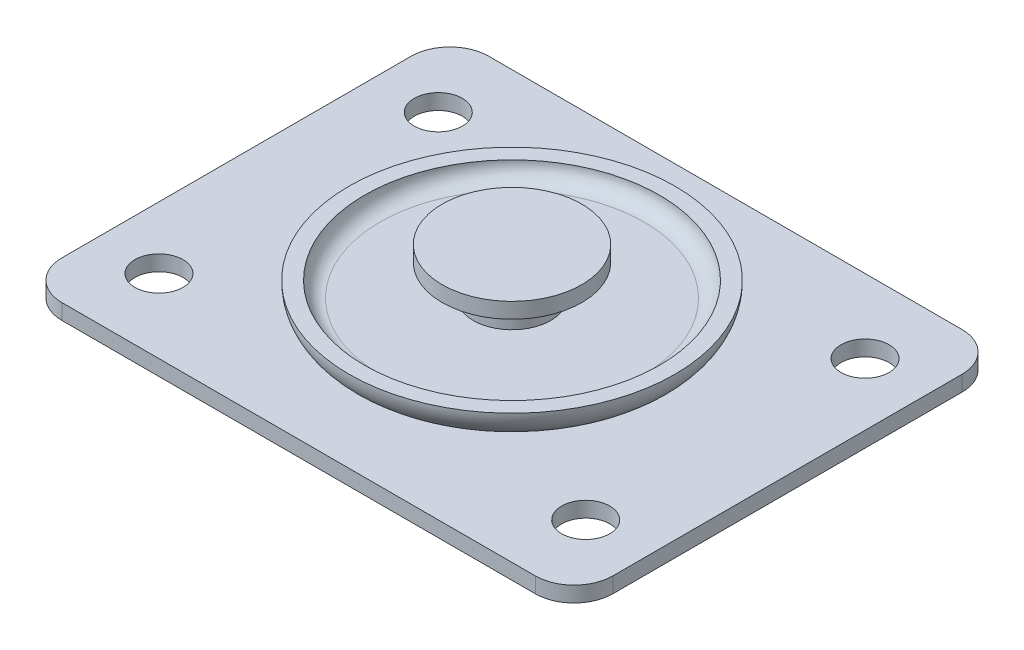
ISO-10303-21;
HEADER;
FILE_DESCRIPTION(('STEP AP214'),'2;1');
FILE_NAME('part.step','',(''),(''),'','','');
FILE_SCHEMA(('AUTOMOTIVE_DESIGN { 1 0 10303 214 1 1 1 1 }'));
ENDSEC;
DATA;
#1=APPLICATION_CONTEXT('core data for automotive mechanical design processes');
#2=APPLICATION_PROTOCOL_DEFINITION('international standard','automotive_design',2000,#1);
#3=PRODUCT_CONTEXT('',#1,'mechanical');
#4=PRODUCT('Part','Part','',(#3));
#5=PRODUCT_RELATED_PRODUCT_CATEGORY('part','',(#4));
#6=PRODUCT_DEFINITION_FORMATION('','',#4);
#7=PRODUCT_DEFINITION_CONTEXT('part definition',#1,'design');
#8=PRODUCT_DEFINITION('design','',#6,#7);
#9=PRODUCT_DEFINITION_SHAPE('','',#8);
#10=(LENGTH_UNIT() NAMED_UNIT(*) SI_UNIT(.MILLI.,.METRE.));
#11=(NAMED_UNIT(*) PLANE_ANGLE_UNIT() SI_UNIT($,.RADIAN.));
#12=(NAMED_UNIT(*) SI_UNIT($,.STERADIAN.) SOLID_ANGLE_UNIT());
#13=UNCERTAINTY_MEASURE_WITH_UNIT(LENGTH_MEASURE(1.E-05),#10,'distance_accuracy_value','');
#14=(GEOMETRIC_REPRESENTATION_CONTEXT(3) GLOBAL_UNCERTAINTY_ASSIGNED_CONTEXT((#13)) GLOBAL_UNIT_ASSIGNED_CONTEXT((#10,
#11,#12)) REPRESENTATION_CONTEXT('',''));
#15=CARTESIAN_POINT('',(0.,0.,0.));
#16=DIRECTION('',(0.,0.,1.));
#17=DIRECTION('',(1.,0.,0.));
#18=AXIS2_PLACEMENT_3D('',#15,#16,#17);
#19=CARTESIAN_POINT('',(-2.08166817117217E-13,2.,0.));
#20=DIRECTION('',(0.,1.,0.));
#21=DIRECTION('',(0.,0.,1.));
#22=AXIS2_PLACEMENT_3D('',#19,#20,#21);
#23=TOROIDAL_SURFACE('',#22,17.0000000000004,3.99999999999971);
#24=CARTESIAN_POINT('',(-2.08166817117217E-13,-2.,0.));
#25=DIRECTION('',(0.,1.,0.));
#26=DIRECTION('',(0.,0.,1.));
#27=AXIS2_PLACEMENT_3D('',#24,#25,#26);
#28=CIRCLE('',#27,17.0000000000004);
#29=CARTESIAN_POINT('',(-2.08166817117217E-13,-2.,17.0000000000004));
#30=VERTEX_POINT('',#29);
#31=EDGE_CURVE('E188',#30,#30,#28,.F.);
#32=ORIENTED_EDGE('',*,*,#31,.F.);
#33=EDGE_LOOP('',(#32));
#34=FACE_BOUND('',#33,.T.);
#35=CARTESIAN_POINT('',(-2.08166817117217E-13,2.,0.));
#36=DIRECTION('',(0.,1.,0.));
#37=DIRECTION('',(0.,0.,1.));
#38=AXIS2_PLACEMENT_3D('',#35,#36,#37);
#39=CIRCLE('',#38,21.);
#40=CARTESIAN_POINT('',(-2.08166817117217E-13,2.,21.));
#41=VERTEX_POINT('',#40);
#42=EDGE_CURVE('E193',#41,#41,#39,.T.);
#43=ORIENTED_EDGE('',*,*,#42,.F.);
#44=EDGE_LOOP('',(#43));
#45=FACE_BOUND('',#44,.T.);
#46=ADVANCED_FACE('F44',(#34,#45),#23,.T.);
#47=CARTESIAN_POINT('',(-2.08166817117217E-13,2.85578852232682E-13,0.));
#48=DIRECTION('',(0.,1.,0.));
#49=DIRECTION('',(0.,0.,1.));
#50=AXIS2_PLACEMENT_3D('',#47,#48,#49);
#51=PLANE('',#50);
#52=CARTESIAN_POINT('',(0.,2.85578852232682E-13,0.));
#53=DIRECTION('',(0.,1.,0.));
#54=DIRECTION('',(0.,0.,1.));
#55=AXIS2_PLACEMENT_3D('',#52,#53,#54);
#56=CIRCLE('',#55,5.);
#57=CARTESIAN_POINT('',(0.,2.85578852232682E-13,5.));
#58=VERTEX_POINT('',#57);
#59=EDGE_CURVE('E142',#58,#58,#56,.T.);
#60=ORIENTED_EDGE('',*,*,#59,.F.);
#61=EDGE_LOOP('',(#60));
#62=FACE_BOUND('',#61,.T.);
#63=CARTESIAN_POINT('',(-2.08166817117217E-13,2.84494650060196E-13,0.));
#64=DIRECTION('',(0.,1.,0.));
#65=DIRECTION('',(0.,0.,1.));
#66=AXIS2_PLACEMENT_3D('',#63,#64,#65);
#67=CIRCLE('',#66,17.0000000000004);
#68=CARTESIAN_POINT('',(-2.08166817117217E-13,2.84494650060196E-13,17.0000000000004));
#69=VERTEX_POINT('',#68);
#70=EDGE_CURVE('E149',#69,#69,#67,.T.);
#71=ORIENTED_EDGE('',*,*,#70,.T.);
#72=EDGE_LOOP('',(#71));
#73=FACE_BOUND('',#72,.T.);
#74=ADVANCED_FACE('F219',(#62,#73),#51,.T.);
#75=CARTESIAN_POINT('',(-2.08166817117217E-13,2.,0.));
#76=DIRECTION('',(0.,1.,0.));
#77=DIRECTION('',(0.,0.,1.));
#78=AXIS2_PLACEMENT_3D('',#75,#76,#77);
#79=TOROIDAL_SURFACE('',#78,17.0000000000004,1.99999999999972);
#80=CARTESIAN_POINT('',(-2.08166817117217E-13,2.,0.));
#81=DIRECTION('',(0.,1.,0.));
#82=DIRECTION('',(0.,0.,1.));
#83=AXIS2_PLACEMENT_3D('',#80,#81,#82);
#84=CIRCLE('',#83,19.0000000000001);
#85=CARTESIAN_POINT('',(-2.08166817117217E-13,2.,19.0000000000001));
#86=VERTEX_POINT('',#85);
#87=EDGE_CURVE('E213',#86,#86,#84,.T.);
#88=ORIENTED_EDGE('',*,*,#87,.T.);
#89=EDGE_LOOP('',(#88));
#90=FACE_BOUND('',#89,.T.);
#91=ORIENTED_EDGE('',*,*,#70,.F.);
#92=EDGE_LOOP('',(#91));
#93=FACE_BOUND('',#92,.T.);
#94=ADVANCED_FACE('F225',(#90,#93),#79,.F.);
#95=CARTESIAN_POINT('',(18.9999999999999,2.,0.));
#96=DIRECTION('',(0.,1.,0.));
#97=DIRECTION('',(0.,0.,1.));
#98=AXIS2_PLACEMENT_3D('',#95,#96,#97);
#99=PLANE('',#98);
#100=ORIENTED_EDGE('',*,*,#42,.T.);
#101=EDGE_LOOP('',(#100));
#102=FACE_BOUND('',#101,.T.);
#103=ORIENTED_EDGE('',*,*,#87,.F.);
#104=EDGE_LOOP('',(#103));
#105=FACE_BOUND('',#104,.T.);
#106=ADVANCED_FACE('F221',(#102,#105),#99,.T.);
#107=CARTESIAN_POINT('',(35.5,-4.,27.5));
#108=DIRECTION('',(1.,0.,0.));
#109=DIRECTION('',(0.,0.,-1.));
#110=AXIS2_PLACEMENT_3D('',#107,#108,#109);
#111=PLANE('',#110);
#112=DIRECTION('',(0.,0.,-1.));
#113=VECTOR('',#112,1.);
#114=CARTESIAN_POINT('',(35.5,-4.,27.5));
#115=LINE('',#114,#113);
#116=CARTESIAN_POINT('',(35.5,-4.,22.5));
#117=VERTEX_POINT('',#116);
#118=CARTESIAN_POINT('',(35.5,-4.,-22.5));
#119=VERTEX_POINT('',#118);
#120=EDGE_CURVE('E208',#117,#119,#115,.T.);
#121=ORIENTED_EDGE('',*,*,#120,.T.);
#122=DIRECTION('',(0.,1.,0.));
#123=VECTOR('',#122,1.);
#124=CARTESIAN_POINT('',(35.5,-4.,-22.5));
#125=LINE('',#124,#123);
#126=CARTESIAN_POINT('',(35.5,-2.,-22.5));
#127=VERTEX_POINT('',#126);
#128=EDGE_CURVE('E133',#119,#127,#125,.T.);
#129=ORIENTED_EDGE('',*,*,#128,.T.);
#130=DIRECTION('',(0.,0.,-1.));
#131=VECTOR('',#130,1.);
#132=CARTESIAN_POINT('',(35.5,-2.,27.5));
#133=LINE('',#132,#131);
#134=CARTESIAN_POINT('',(35.5,-2.,22.5));
#135=VERTEX_POINT('',#134);
#136=EDGE_CURVE('E113',#135,#127,#133,.T.);
#137=ORIENTED_EDGE('',*,*,#136,.F.);
#138=DIRECTION('',(0.,1.,0.));
#139=VECTOR('',#138,1.);
#140=CARTESIAN_POINT('',(35.5,-4.,22.5));
#141=LINE('',#140,#139);
#142=EDGE_CURVE('E128',#135,#117,#141,.F.);
#143=ORIENTED_EDGE('',*,*,#142,.T.);
#144=EDGE_LOOP('',(#121,#129,#137,#143));
#145=FACE_BOUND('',#144,.T.);
#146=ADVANCED_FACE('F129',(#145),#111,.T.);
#147=CARTESIAN_POINT('',(-35.5,-4.,27.5));
#148=DIRECTION('',(0.,0.,1.));
#149=DIRECTION('',(1.,0.,0.));
#150=AXIS2_PLACEMENT_3D('',#147,#148,#149);
#151=PLANE('',#150);
#152=DIRECTION('',(1.,0.,0.));
#153=VECTOR('',#152,1.);
#154=CARTESIAN_POINT('',(-35.5,-4.,27.5));
#155=LINE('',#154,#153);
#156=CARTESIAN_POINT('',(-30.5,-4.,27.5));
#157=VERTEX_POINT('',#156);
#158=CARTESIAN_POINT('',(30.5,-4.,27.5));
#159=VERTEX_POINT('',#158);
#160=EDGE_CURVE('E187',#157,#159,#155,.T.);
#161=ORIENTED_EDGE('',*,*,#160,.T.);
#162=DIRECTION('',(0.,1.,0.));
#163=VECTOR('',#162,1.);
#164=CARTESIAN_POINT('',(30.5,-4.,27.5));
#165=LINE('',#164,#163);
#166=CARTESIAN_POINT('',(30.5,-2.,27.5));
#167=VERTEX_POINT('',#166);
#168=EDGE_CURVE('E178',#159,#167,#165,.T.);
#169=ORIENTED_EDGE('',*,*,#168,.T.);
#170=DIRECTION('',(1.,0.,0.));
#171=VECTOR('',#170,1.);
#172=CARTESIAN_POINT('',(-35.5,-2.,27.5));
#173=LINE('',#172,#171);
#174=CARTESIAN_POINT('',(-30.5,-2.,27.5));
#175=VERTEX_POINT('',#174);
#176=EDGE_CURVE('E120',#175,#167,#173,.T.);
#177=ORIENTED_EDGE('',*,*,#176,.F.);
#178=DIRECTION('',(0.,1.,0.));
#179=VECTOR('',#178,1.);
#180=CARTESIAN_POINT('',(-30.5,-4.,27.5));
#181=LINE('',#180,#179);
#182=EDGE_CURVE('E176',#175,#157,#181,.F.);
#183=ORIENTED_EDGE('',*,*,#182,.T.);
#184=EDGE_LOOP('',(#161,#169,#177,#183));
#185=FACE_BOUND('',#184,.T.);
#186=ADVANCED_FACE('F184',(#185),#151,.T.);
#187=CARTESIAN_POINT('',(-35.5,-4.,-27.5));
#188=DIRECTION('',(-1.,0.,0.));
#189=DIRECTION('',(0.,0.,1.));
#190=AXIS2_PLACEMENT_3D('',#187,#188,#189);
#191=PLANE('',#190);
#192=DIRECTION('',(0.,0.,1.));
#193=VECTOR('',#192,1.);
#194=CARTESIAN_POINT('',(-35.5,-4.,-27.5));
#195=LINE('',#194,#193);
#196=CARTESIAN_POINT('',(-35.5,-4.,-22.5));
#197=VERTEX_POINT('',#196);
#198=CARTESIAN_POINT('',(-35.5,-4.,22.5));
#199=VERTEX_POINT('',#198);
#200=EDGE_CURVE('E189',#197,#199,#195,.T.);
#201=ORIENTED_EDGE('',*,*,#200,.T.);
#202=DIRECTION('',(0.,1.,0.));
#203=VECTOR('',#202,1.);
#204=CARTESIAN_POINT('',(-35.5,-4.,22.5));
#205=LINE('',#204,#203);
#206=CARTESIAN_POINT('',(-35.5,-2.,22.5));
#207=VERTEX_POINT('',#206);
#208=EDGE_CURVE('E11',#199,#207,#205,.T.);
#209=ORIENTED_EDGE('',*,*,#208,.T.);
#210=DIRECTION('',(0.,0.,1.));
#211=VECTOR('',#210,1.);
#212=CARTESIAN_POINT('',(-35.5,-2.,-27.5));
#213=LINE('',#212,#211);
#214=CARTESIAN_POINT('',(-35.5,-2.,-22.5));
#215=VERTEX_POINT('',#214);
#216=EDGE_CURVE('E201',#215,#207,#213,.T.);
#217=ORIENTED_EDGE('',*,*,#216,.F.);
#218=DIRECTION('',(0.,1.,0.));
#219=VECTOR('',#218,1.);
#220=CARTESIAN_POINT('',(-35.5,-4.,-22.5));
#221=LINE('',#220,#219);
#222=EDGE_CURVE('E53',#215,#197,#221,.F.);
#223=ORIENTED_EDGE('',*,*,#222,.T.);
#224=EDGE_LOOP('',(#201,#209,#217,#223));
#225=FACE_BOUND('',#224,.T.);
#226=ADVANCED_FACE('F260',(#225),#191,.T.);
#227=CARTESIAN_POINT('',(35.5,-4.,-27.5));
#228=DIRECTION('',(0.,0.,-1.));
#229=DIRECTION('',(-1.,0.,0.));
#230=AXIS2_PLACEMENT_3D('',#227,#228,#229);
#231=PLANE('',#230);
#232=DIRECTION('',(-1.,0.,0.));
#233=VECTOR('',#232,1.);
#234=CARTESIAN_POINT('',(35.5,-2.,-27.5));
#235=LINE('',#234,#233);
#236=CARTESIAN_POINT('',(30.5,-2.,-27.5));
#237=VERTEX_POINT('',#236);
#238=CARTESIAN_POINT('',(-30.5,-2.,-27.5));
#239=VERTEX_POINT('',#238);
#240=EDGE_CURVE('E131',#237,#239,#235,.T.);
#241=ORIENTED_EDGE('',*,*,#240,.F.);
#242=DIRECTION('',(0.,1.,0.));
#243=VECTOR('',#242,1.);
#244=CARTESIAN_POINT('',(30.5,-4.,-27.5));
#245=LINE('',#244,#243);
#246=CARTESIAN_POINT('',(30.5,-4.,-27.5));
#247=VERTEX_POINT('',#246);
#248=EDGE_CURVE('E162',#237,#247,#245,.F.);
#249=ORIENTED_EDGE('',*,*,#248,.T.);
#250=DIRECTION('',(-1.,0.,0.));
#251=VECTOR('',#250,1.);
#252=CARTESIAN_POINT('',(35.5,-4.,-27.5));
#253=LINE('',#252,#251);
#254=CARTESIAN_POINT('',(-30.5,-4.,-27.5));
#255=VERTEX_POINT('',#254);
#256=EDGE_CURVE('E198',#247,#255,#253,.T.);
#257=ORIENTED_EDGE('',*,*,#256,.T.);
#258=DIRECTION('',(0.,1.,0.));
#259=VECTOR('',#258,1.);
#260=CARTESIAN_POINT('',(-30.5,-4.,-27.5));
#261=LINE('',#260,#259);
#262=EDGE_CURVE('E157',#255,#239,#261,.T.);
#263=ORIENTED_EDGE('',*,*,#262,.T.);
#264=EDGE_LOOP('',(#241,#249,#257,#263));
#265=FACE_BOUND('',#264,.T.);
#266=ADVANCED_FACE('F263',(#265),#231,.T.);
#267=CARTESIAN_POINT('',(0.,-4.,0.));
#268=DIRECTION('',(0.,1.,0.));
#269=DIRECTION('',(0.,0.,1.));
#270=AXIS2_PLACEMENT_3D('',#267,#268,#269);
#271=PLANE('',#270);
#272=CARTESIAN_POINT('',(-27.5,-4.,-18.));
#273=DIRECTION('',(0.,1.,0.));
#274=DIRECTION('',(0.,0.,1.));
#275=AXIS2_PLACEMENT_3D('',#272,#273,#274);
#276=CIRCLE('',#275,3.09999999999998);
#277=CARTESIAN_POINT('',(-27.5,-4.,-14.9));
#278=VERTEX_POINT('',#277);
#279=EDGE_CURVE('E308',#278,#278,#276,.T.);
#280=ORIENTED_EDGE('',*,*,#279,.T.);
#281=EDGE_LOOP('',(#280));
#282=FACE_BOUND('',#281,.T.);
#283=CARTESIAN_POINT('',(-27.5,-4.,18.));
#284=DIRECTION('',(0.,1.,0.));
#285=DIRECTION('',(0.,0.,1.));
#286=AXIS2_PLACEMENT_3D('',#283,#284,#285);
#287=CIRCLE('',#286,3.09999999999998);
#288=CARTESIAN_POINT('',(-27.5,-4.,21.1));
#289=VERTEX_POINT('',#288);
#290=EDGE_CURVE('E298',#289,#289,#287,.T.);
#291=ORIENTED_EDGE('',*,*,#290,.T.);
#292=EDGE_LOOP('',(#291));
#293=FACE_BOUND('',#292,.T.);
#294=CARTESIAN_POINT('',(27.5,-4.,18.));
#295=DIRECTION('',(0.,1.,0.));
#296=DIRECTION('',(0.,0.,1.));
#297=AXIS2_PLACEMENT_3D('',#294,#295,#296);
#298=CIRCLE('',#297,3.09999999999998);
#299=CARTESIAN_POINT('',(27.5,-4.,21.1));
#300=VERTEX_POINT('',#299);
#301=EDGE_CURVE('E289',#300,#300,#298,.T.);
#302=ORIENTED_EDGE('',*,*,#301,.T.);
#303=EDGE_LOOP('',(#302));
#304=FACE_BOUND('',#303,.T.);
#305=CARTESIAN_POINT('',(27.5,-4.,-18.));
#306=DIRECTION('',(0.,1.,0.));
#307=DIRECTION('',(0.,0.,1.));
#308=AXIS2_PLACEMENT_3D('',#305,#306,#307);
#309=CIRCLE('',#308,3.09999999999998);
#310=CARTESIAN_POINT('',(27.5,-4.,-14.9));
#311=VERTEX_POINT('',#310);
#312=EDGE_CURVE('E285',#311,#311,#309,.T.);
#313=ORIENTED_EDGE('',*,*,#312,.T.);
#314=EDGE_LOOP('',(#313));
#315=FACE_BOUND('',#314,.T.);
#316=ORIENTED_EDGE('',*,*,#256,.F.);
#317=CARTESIAN_POINT('',(30.5,-4.,-22.5));
#318=DIRECTION('',(0.,1.,0.));
#319=DIRECTION('',(0.,0.,1.));
#320=AXIS2_PLACEMENT_3D('',#317,#318,#319);
#321=CIRCLE('',#320,5.);
#322=EDGE_CURVE('E173',#247,#119,#321,.F.);
#323=ORIENTED_EDGE('',*,*,#322,.T.);
#324=ORIENTED_EDGE('',*,*,#120,.F.);
#325=CARTESIAN_POINT('',(30.5,-4.,22.5));
#326=DIRECTION('',(0.,1.,0.));
#327=DIRECTION('',(0.,0.,1.));
#328=AXIS2_PLACEMENT_3D('',#325,#326,#327);
#329=CIRCLE('',#328,5.);
#330=EDGE_CURVE('E139',#117,#159,#329,.F.);
#331=ORIENTED_EDGE('',*,*,#330,.T.);
#332=ORIENTED_EDGE('',*,*,#160,.F.);
#333=CARTESIAN_POINT('',(-30.5,-4.,22.5));
#334=DIRECTION('',(0.,1.,0.));
#335=DIRECTION('',(0.,0.,1.));
#336=AXIS2_PLACEMENT_3D('',#333,#334,#335);
#337=CIRCLE('',#336,5.);
#338=EDGE_CURVE('E62',#157,#199,#337,.F.);
#339=ORIENTED_EDGE('',*,*,#338,.T.);
#340=ORIENTED_EDGE('',*,*,#200,.F.);
#341=CARTESIAN_POINT('',(-30.5,-4.,-22.5));
#342=DIRECTION('',(0.,1.,0.));
#343=DIRECTION('',(0.,0.,1.));
#344=AXIS2_PLACEMENT_3D('',#341,#342,#343);
#345=CIRCLE('',#344,5.);
#346=EDGE_CURVE('E167',#197,#255,#345,.F.);
#347=ORIENTED_EDGE('',*,*,#346,.T.);
#348=EDGE_LOOP('',(#316,#323,#324,#331,#332,#339,#340,#347));
#349=FACE_BOUND('',#348,.T.);
#350=ADVANCED_FACE('F317',(#282,#293,#304,#315,#349),#271,.F.);
#351=CARTESIAN_POINT('',(0.,-2.,0.));
#352=DIRECTION('',(0.,1.,0.));
#353=DIRECTION('',(0.,0.,1.));
#354=AXIS2_PLACEMENT_3D('',#351,#352,#353);
#355=PLANE('',#354);
#356=CARTESIAN_POINT('',(-27.5,-2.,-18.));
#357=DIRECTION('',(0.,1.,0.));
#358=DIRECTION('',(0.,0.,1.));
#359=AXIS2_PLACEMENT_3D('',#356,#357,#358);
#360=CIRCLE('',#359,3.09999999999999);
#361=CARTESIAN_POINT('',(-27.5,-2.,-14.9));
#362=VERTEX_POINT('',#361);
#363=EDGE_CURVE('E309',#362,#362,#360,.T.);
#364=ORIENTED_EDGE('',*,*,#363,.F.);
#365=EDGE_LOOP('',(#364));
#366=FACE_BOUND('',#365,.T.);
#367=CARTESIAN_POINT('',(-27.5,-2.,18.));
#368=DIRECTION('',(0.,1.,0.));
#369=DIRECTION('',(0.,0.,1.));
#370=AXIS2_PLACEMENT_3D('',#367,#368,#369);
#371=CIRCLE('',#370,3.09999999999999);
#372=CARTESIAN_POINT('',(-27.5,-2.,21.1));
#373=VERTEX_POINT('',#372);
#374=EDGE_CURVE('E305',#373,#373,#371,.T.);
#375=ORIENTED_EDGE('',*,*,#374,.F.);
#376=EDGE_LOOP('',(#375));
#377=FACE_BOUND('',#376,.T.);
#378=CARTESIAN_POINT('',(27.5,-2.,18.));
#379=DIRECTION('',(0.,1.,0.));
#380=DIRECTION('',(0.,0.,1.));
#381=AXIS2_PLACEMENT_3D('',#378,#379,#380);
#382=CIRCLE('',#381,3.09999999999999);
#383=CARTESIAN_POINT('',(27.5,-2.,21.1));
#384=VERTEX_POINT('',#383);
#385=EDGE_CURVE('E294',#384,#384,#382,.T.);
#386=ORIENTED_EDGE('',*,*,#385,.F.);
#387=EDGE_LOOP('',(#386));
#388=FACE_BOUND('',#387,.T.);
#389=CARTESIAN_POINT('',(27.5,-2.,-18.));
#390=DIRECTION('',(0.,1.,0.));
#391=DIRECTION('',(0.,0.,1.));
#392=AXIS2_PLACEMENT_3D('',#389,#390,#391);
#393=CIRCLE('',#392,3.09999999999999);
#394=CARTESIAN_POINT('',(27.5,-2.,-14.9));
#395=VERTEX_POINT('',#394);
#396=EDGE_CURVE('E286',#395,#395,#393,.T.);
#397=ORIENTED_EDGE('',*,*,#396,.F.);
#398=EDGE_LOOP('',(#397));
#399=FACE_BOUND('',#398,.T.);
#400=ORIENTED_EDGE('',*,*,#31,.T.);
#401=EDGE_LOOP('',(#400));
#402=FACE_BOUND('',#401,.T.);
#403=ORIENTED_EDGE('',*,*,#136,.T.);
#404=CARTESIAN_POINT('',(30.5,-2.,-22.5));
#405=DIRECTION('',(0.,1.,0.));
#406=DIRECTION('',(0.,0.,1.));
#407=AXIS2_PLACEMENT_3D('',#404,#405,#406);
#408=CIRCLE('',#407,5.);
#409=EDGE_CURVE('E122',#127,#237,#408,.T.);
#410=ORIENTED_EDGE('',*,*,#409,.T.);
#411=ORIENTED_EDGE('',*,*,#240,.T.);
#412=CARTESIAN_POINT('',(-30.5,-2.,-22.5));
#413=DIRECTION('',(0.,1.,0.));
#414=DIRECTION('',(0.,0.,1.));
#415=AXIS2_PLACEMENT_3D('',#412,#413,#414);
#416=CIRCLE('',#415,5.);
#417=EDGE_CURVE('E148',#239,#215,#416,.T.);
#418=ORIENTED_EDGE('',*,*,#417,.T.);
#419=ORIENTED_EDGE('',*,*,#216,.T.);
#420=CARTESIAN_POINT('',(-30.5,-2.,22.5));
#421=DIRECTION('',(0.,1.,0.));
#422=DIRECTION('',(0.,0.,1.));
#423=AXIS2_PLACEMENT_3D('',#420,#421,#422);
#424=CIRCLE('',#423,5.);
#425=EDGE_CURVE('E123',#207,#175,#424,.T.);
#426=ORIENTED_EDGE('',*,*,#425,.T.);
#427=ORIENTED_EDGE('',*,*,#176,.T.);
#428=CARTESIAN_POINT('',(30.5,-2.,22.5));
#429=DIRECTION('',(0.,1.,0.));
#430=DIRECTION('',(0.,0.,1.));
#431=AXIS2_PLACEMENT_3D('',#428,#429,#430);
#432=CIRCLE('',#431,5.);
#433=EDGE_CURVE('E115',#167,#135,#432,.T.);
#434=ORIENTED_EDGE('',*,*,#433,.T.);
#435=EDGE_LOOP('',(#403,#410,#411,#418,#419,#426,#427,#434));
#436=FACE_BOUND('',#435,.T.);
#437=ADVANCED_FACE('F111',(#366,#377,#388,#399,#402,#436),#355,.T.);
#438=CARTESIAN_POINT('',(0.,0.,0.));
#439=DIRECTION('',(0.,1.,0.));
#440=DIRECTION('',(0.,0.,1.));
#441=AXIS2_PLACEMENT_3D('',#438,#439,#440);
#442=CYLINDRICAL_SURFACE('',#441,5.);
#443=ORIENTED_EDGE('',*,*,#59,.T.);
#444=EDGE_LOOP('',(#443));
#445=FACE_BOUND('',#444,.T.);
#446=CARTESIAN_POINT('',(0.,4.,0.));
#447=DIRECTION('',(0.,1.,0.));
#448=DIRECTION('',(0.,0.,1.));
#449=AXIS2_PLACEMENT_3D('',#446,#447,#448);
#450=CIRCLE('',#449,5.);
#451=CARTESIAN_POINT('',(0.,4.,5.));
#452=VERTEX_POINT('',#451);
#453=EDGE_CURVE('E279',#452,#452,#450,.T.);
#454=ORIENTED_EDGE('',*,*,#453,.F.);
#455=EDGE_LOOP('',(#454));
#456=FACE_BOUND('',#455,.T.);
#457=ADVANCED_FACE('F318',(#445,#456),#442,.T.);
#458=CARTESIAN_POINT('',(0.,6.,0.));
#459=DIRECTION('',(0.,1.,0.));
#460=DIRECTION('',(0.,0.,1.));
#461=AXIS2_PLACEMENT_3D('',#458,#459,#460);
#462=PLANE('',#461);
#463=CARTESIAN_POINT('',(0.,6.,0.));
#464=DIRECTION('',(0.,1.,0.));
#465=DIRECTION('',(0.,0.,1.));
#466=AXIS2_PLACEMENT_3D('',#463,#464,#465);
#467=CIRCLE('',#466,9.);
#468=CARTESIAN_POINT('',(0.,6.,9.));
#469=VERTEX_POINT('',#468);
#470=EDGE_CURVE('E136',#469,#469,#467,.T.);
#471=ORIENTED_EDGE('',*,*,#470,.T.);
#472=EDGE_LOOP('',(#471));
#473=FACE_BOUND('',#472,.T.);
#474=ADVANCED_FACE('F349',(#473),#462,.T.);
#475=CARTESIAN_POINT('',(0.,0.,0.));
#476=DIRECTION('',(0.,1.,0.));
#477=DIRECTION('',(0.,0.,1.));
#478=AXIS2_PLACEMENT_3D('',#475,#476,#477);
#479=CYLINDRICAL_SURFACE('',#478,9.);
#480=CARTESIAN_POINT('',(0.,4.,0.));
#481=DIRECTION('',(0.,1.,0.));
#482=DIRECTION('',(0.,0.,1.));
#483=AXIS2_PLACEMENT_3D('',#480,#481,#482);
#484=CIRCLE('',#483,9.);
#485=CARTESIAN_POINT('',(0.,4.,9.));
#486=VERTEX_POINT('',#485);
#487=EDGE_CURVE('E273',#486,#486,#484,.T.);
#488=ORIENTED_EDGE('',*,*,#487,.T.);
#489=EDGE_LOOP('',(#488));
#490=FACE_BOUND('',#489,.T.);
#491=ORIENTED_EDGE('',*,*,#470,.F.);
#492=EDGE_LOOP('',(#491));
#493=FACE_BOUND('',#492,.T.);
#494=ADVANCED_FACE('F341',(#490,#493),#479,.T.);
#495=CARTESIAN_POINT('',(9.,4.,0.));
#496=DIRECTION('',(0.,-1.,0.));
#497=DIRECTION('',(0.,0.,-1.));
#498=AXIS2_PLACEMENT_3D('',#495,#496,#497);
#499=PLANE('',#498);
#500=ORIENTED_EDGE('',*,*,#453,.T.);
#501=EDGE_LOOP('',(#500));
#502=FACE_BOUND('',#501,.T.);
#503=ORIENTED_EDGE('',*,*,#487,.F.);
#504=EDGE_LOOP('',(#503));
#505=FACE_BOUND('',#504,.T.);
#506=ADVANCED_FACE('F332',(#502,#505),#499,.T.);
#507=CARTESIAN_POINT('',(27.5,-2.,-18.));
#508=DIRECTION('',(0.,1.,0.));
#509=DIRECTION('',(0.,0.,1.));
#510=AXIS2_PLACEMENT_3D('',#507,#508,#509);
#511=CYLINDRICAL_SURFACE('',#510,3.09999999999999);
#512=ORIENTED_EDGE('',*,*,#312,.F.);
#513=EDGE_LOOP('',(#512));
#514=FACE_BOUND('',#513,.T.);
#515=ORIENTED_EDGE('',*,*,#396,.T.);
#516=EDGE_LOOP('',(#515));
#517=FACE_BOUND('',#516,.T.);
#518=ADVANCED_FACE('F327',(#514,#517),#511,.F.);
#519=CARTESIAN_POINT('',(27.5,-2.,18.));
#520=DIRECTION('',(0.,1.,0.));
#521=DIRECTION('',(0.,0.,1.));
#522=AXIS2_PLACEMENT_3D('',#519,#520,#521);
#523=CYLINDRICAL_SURFACE('',#522,3.09999999999999);
#524=ORIENTED_EDGE('',*,*,#301,.F.);
#525=EDGE_LOOP('',(#524));
#526=FACE_BOUND('',#525,.T.);
#527=ORIENTED_EDGE('',*,*,#385,.T.);
#528=EDGE_LOOP('',(#527));
#529=FACE_BOUND('',#528,.T.);
#530=ADVANCED_FACE('F329',(#526,#529),#523,.F.);
#531=CARTESIAN_POINT('',(-27.5,-2.,18.));
#532=DIRECTION('',(0.,1.,0.));
#533=DIRECTION('',(0.,0.,1.));
#534=AXIS2_PLACEMENT_3D('',#531,#532,#533);
#535=CYLINDRICAL_SURFACE('',#534,3.09999999999999);
#536=ORIENTED_EDGE('',*,*,#290,.F.);
#537=EDGE_LOOP('',(#536));
#538=FACE_BOUND('',#537,.T.);
#539=ORIENTED_EDGE('',*,*,#374,.T.);
#540=EDGE_LOOP('',(#539));
#541=FACE_BOUND('',#540,.T.);
#542=ADVANCED_FACE('F338',(#538,#541),#535,.F.);
#543=CARTESIAN_POINT('',(-27.5,-2.,-18.));
#544=DIRECTION('',(0.,1.,0.));
#545=DIRECTION('',(0.,0.,1.));
#546=AXIS2_PLACEMENT_3D('',#543,#544,#545);
#547=CYLINDRICAL_SURFACE('',#546,3.09999999999999);
#548=ORIENTED_EDGE('',*,*,#279,.F.);
#549=EDGE_LOOP('',(#548));
#550=FACE_BOUND('',#549,.T.);
#551=ORIENTED_EDGE('',*,*,#363,.T.);
#552=EDGE_LOOP('',(#551));
#553=FACE_BOUND('',#552,.T.);
#554=ADVANCED_FACE('F246',(#550,#553),#547,.F.);
#555=CARTESIAN_POINT('',(30.5,-4.,-22.5));
#556=DIRECTION('',(0.,1.,0.));
#557=DIRECTION('',(0.,0.,1.));
#558=AXIS2_PLACEMENT_3D('',#555,#556,#557);
#559=CYLINDRICAL_SURFACE('',#558,5.);
#560=ORIENTED_EDGE('',*,*,#322,.F.);
#561=ORIENTED_EDGE('',*,*,#248,.F.);
#562=ORIENTED_EDGE('',*,*,#409,.F.);
#563=ORIENTED_EDGE('',*,*,#128,.F.);
#564=EDGE_LOOP('',(#560,#561,#562,#563));
#565=FACE_BOUND('',#564,.T.);
#566=ADVANCED_FACE('F243',(#565),#559,.T.);
#567=CARTESIAN_POINT('',(30.5,-4.,22.5));
#568=DIRECTION('',(0.,1.,0.));
#569=DIRECTION('',(0.,0.,1.));
#570=AXIS2_PLACEMENT_3D('',#567,#568,#569);
#571=CYLINDRICAL_SURFACE('',#570,5.);
#572=ORIENTED_EDGE('',*,*,#330,.F.);
#573=ORIENTED_EDGE('',*,*,#142,.F.);
#574=ORIENTED_EDGE('',*,*,#433,.F.);
#575=ORIENTED_EDGE('',*,*,#168,.F.);
#576=EDGE_LOOP('',(#572,#573,#574,#575));
#577=FACE_BOUND('',#576,.T.);
#578=ADVANCED_FACE('F138',(#577),#571,.T.);
#579=CARTESIAN_POINT('',(-30.5,-4.,22.5));
#580=DIRECTION('',(0.,1.,0.));
#581=DIRECTION('',(0.,0.,1.));
#582=AXIS2_PLACEMENT_3D('',#579,#580,#581);
#583=CYLINDRICAL_SURFACE('',#582,5.);
#584=ORIENTED_EDGE('',*,*,#338,.F.);
#585=ORIENTED_EDGE('',*,*,#182,.F.);
#586=ORIENTED_EDGE('',*,*,#425,.F.);
#587=ORIENTED_EDGE('',*,*,#208,.F.);
#588=EDGE_LOOP('',(#584,#585,#586,#587));
#589=FACE_BOUND('',#588,.T.);
#590=ADVANCED_FACE('F248',(#589),#583,.T.);
#591=CARTESIAN_POINT('',(-30.5,-4.,-22.5));
#592=DIRECTION('',(0.,1.,0.));
#593=DIRECTION('',(0.,0.,1.));
#594=AXIS2_PLACEMENT_3D('',#591,#592,#593);
#595=CYLINDRICAL_SURFACE('',#594,5.);
#596=ORIENTED_EDGE('',*,*,#346,.F.);
#597=ORIENTED_EDGE('',*,*,#222,.F.);
#598=ORIENTED_EDGE('',*,*,#417,.F.);
#599=ORIENTED_EDGE('',*,*,#262,.F.);
#600=EDGE_LOOP('',(#596,#597,#598,#599));
#601=FACE_BOUND('',#600,.T.);
#602=ADVANCED_FACE('F50',(#601),#595,.T.);
#603=CLOSED_SHELL('',(#46,#74,#94,#106,#146,#186,#226,#266,#350,#437,#457,#474,#494,#506,#518,
#530,#542,#554,#566,#578,#590,#602));
#604=MANIFOLD_SOLID_BREP('B2',#603);
#605=ADVANCED_BREP_SHAPE_REPRESENTATION('',(#18,#604),#14);
#606=SHAPE_DEFINITION_REPRESENTATION(#9,#605);
ENDSEC;
END-ISO-10303-21;
